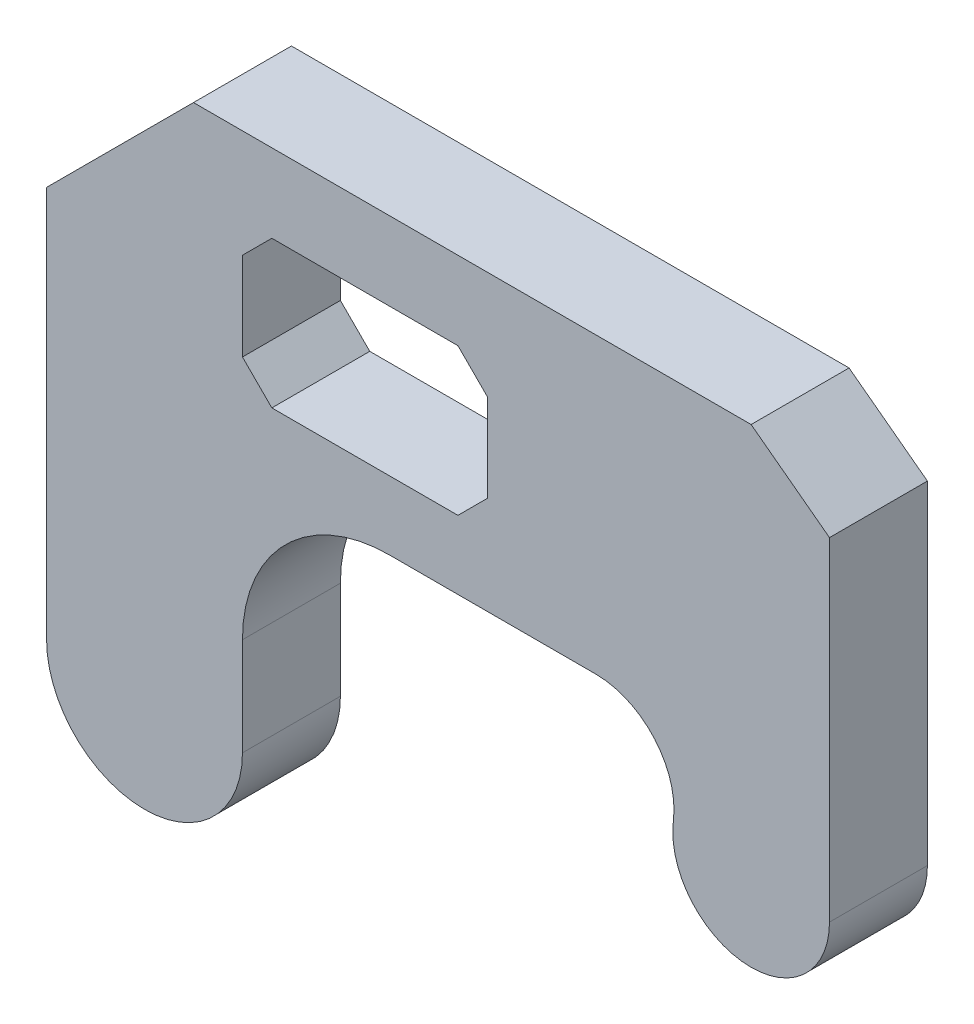
ISO-10303-21;
HEADER;
FILE_DESCRIPTION(('STEP AP214'),'2;1');
FILE_NAME('part.step','',(''),(''),'','','');
FILE_SCHEMA(('AUTOMOTIVE_DESIGN { 1 0 10303 214 1 1 1 1 }'));
ENDSEC;
DATA;
#1=APPLICATION_CONTEXT('core data for automotive mechanical design processes');
#2=APPLICATION_PROTOCOL_DEFINITION('international standard','automotive_design',2000,#1);
#3=PRODUCT_CONTEXT('',#1,'mechanical');
#4=PRODUCT('Part','Part','',(#3));
#5=PRODUCT_RELATED_PRODUCT_CATEGORY('part','',(#4));
#6=PRODUCT_DEFINITION_FORMATION('','',#4);
#7=PRODUCT_DEFINITION_CONTEXT('part definition',#1,'design');
#8=PRODUCT_DEFINITION('design','',#6,#7);
#9=PRODUCT_DEFINITION_SHAPE('','',#8);
#10=(LENGTH_UNIT() NAMED_UNIT(*) SI_UNIT(.MILLI.,.METRE.));
#11=(NAMED_UNIT(*) PLANE_ANGLE_UNIT() SI_UNIT($,.RADIAN.));
#12=(NAMED_UNIT(*) SI_UNIT($,.STERADIAN.) SOLID_ANGLE_UNIT());
#13=UNCERTAINTY_MEASURE_WITH_UNIT(LENGTH_MEASURE(1.E-05),#10,'distance_accuracy_value','');
#14=(GEOMETRIC_REPRESENTATION_CONTEXT(3) GLOBAL_UNCERTAINTY_ASSIGNED_CONTEXT((#13)) GLOBAL_UNIT_ASSIGNED_CONTEXT((#10,
#11,#12)) REPRESENTATION_CONTEXT('',''));
#15=CARTESIAN_POINT('',(0.,0.,0.));
#16=DIRECTION('',(0.,0.,1.));
#17=DIRECTION('',(1.,0.,0.));
#18=AXIS2_PLACEMENT_3D('',#15,#16,#17);
#19=CARTESIAN_POINT('',(10.,0.,10.));
#20=DIRECTION('',(0.,0.,-1.));
#21=DIRECTION('',(-1.,0.,0.));
#22=AXIS2_PLACEMENT_3D('',#19,#20,#21);
#23=PLANE('',#22);
#24=CARTESIAN_POINT('',(10.,0.,10.));
#25=DIRECTION('',(0.,0.,1.));
#26=DIRECTION('',(-1.,0.,0.));
#27=AXIS2_PLACEMENT_3D('',#24,#25,#26);
#28=CIRCLE('',#27,10.);
#29=CARTESIAN_POINT('',(0.,0.,10.));
#30=VERTEX_POINT('',#29);
#31=CARTESIAN_POINT('',(20.,0.,10.));
#32=VERTEX_POINT('',#31);
#33=EDGE_CURVE('E232',#30,#32,#28,.T.);
#34=ORIENTED_EDGE('',*,*,#33,.T.);
#35=DIRECTION('',(0.,1.,0.));
#36=VECTOR('',#35,1.);
#37=CARTESIAN_POINT('',(20.,10.,10.));
#38=LINE('',#37,#36);
#39=CARTESIAN_POINT('',(20.,10.,10.));
#40=VERTEX_POINT('',#39);
#41=EDGE_CURVE('E235',#32,#40,#38,.T.);
#42=ORIENTED_EDGE('',*,*,#41,.T.);
#43=CARTESIAN_POINT('',(35.,10.,10.));
#44=DIRECTION('',(0.,0.,-1.));
#45=DIRECTION('',(1.,0.,0.));
#46=AXIS2_PLACEMENT_3D('',#43,#44,#45);
#47=CIRCLE('',#46,15.);
#48=CARTESIAN_POINT('',(35.,25.,10.));
#49=VERTEX_POINT('',#48);
#50=EDGE_CURVE('E238',#40,#49,#47,.T.);
#51=ORIENTED_EDGE('',*,*,#50,.T.);
#52=DIRECTION('',(1.,0.,0.));
#53=VECTOR('',#52,1.);
#54=CARTESIAN_POINT('',(56.0627460668062,25.,10.));
#55=LINE('',#54,#53);
#56=CARTESIAN_POINT('',(56.0627460668062,25.,10.));
#57=VERTEX_POINT('',#56);
#58=EDGE_CURVE('E240',#49,#57,#55,.T.);
#59=ORIENTED_EDGE('',*,*,#58,.T.);
#60=CARTESIAN_POINT('',(56.0627460668062,17.,10.));
#61=DIRECTION('',(0.,0.,-1.));
#62=DIRECTION('',(1.,0.,0.));
#63=AXIS2_PLACEMENT_3D('',#60,#61,#62);
#64=CIRCLE('',#63,8.);
#65=CARTESIAN_POINT('',(64.,16.,10.));
#66=VERTEX_POINT('',#65);
#67=EDGE_CURVE('E242',#57,#66,#64,.T.);
#68=ORIENTED_EDGE('',*,*,#67,.T.);
#69=CARTESIAN_POINT('',(71.9372539331938,15.,10.));
#70=DIRECTION('',(0.,0.,1.));
#71=DIRECTION('',(-1.,0.,0.));
#72=AXIS2_PLACEMENT_3D('',#69,#70,#71);
#73=CIRCLE('',#72,7.99999999999999);
#74=CARTESIAN_POINT('',(79.9372539331938,15.,10.));
#75=VERTEX_POINT('',#74);
#76=EDGE_CURVE('E244',#66,#75,#73,.T.);
#77=ORIENTED_EDGE('',*,*,#76,.T.);
#78=DIRECTION('',(0.,1.,0.));
#79=VECTOR('',#78,1.);
#80=CARTESIAN_POINT('',(79.9372539331938,49.,10.));
#81=LINE('',#80,#79);
#82=CARTESIAN_POINT('',(79.9372539331938,49.,10.));
#83=VERTEX_POINT('',#82);
#84=EDGE_CURVE('E246',#75,#83,#81,.T.);
#85=ORIENTED_EDGE('',*,*,#84,.T.);
#86=DIRECTION('',(-0.8,0.6,0.));
#87=VECTOR('',#86,1.);
#88=CARTESIAN_POINT('',(71.9372539331938,55.,10.));
#89=LINE('',#88,#87);
#90=CARTESIAN_POINT('',(71.9372539331938,55.,10.));
#91=VERTEX_POINT('',#90);
#92=EDGE_CURVE('E248',#83,#91,#89,.T.);
#93=ORIENTED_EDGE('',*,*,#92,.T.);
#94=DIRECTION('',(-1.,0.,0.));
#95=VECTOR('',#94,1.);
#96=CARTESIAN_POINT('',(15.,55.,10.));
#97=LINE('',#96,#95);
#98=CARTESIAN_POINT('',(15.,55.,10.));
#99=VERTEX_POINT('',#98);
#100=EDGE_CURVE('E250',#91,#99,#97,.T.);
#101=ORIENTED_EDGE('',*,*,#100,.T.);
#102=DIRECTION('',(-0.707106781186547,-0.707106781186548,0.));
#103=VECTOR('',#102,1.);
#104=CARTESIAN_POINT('',(0.,40.,10.));
#105=LINE('',#104,#103);
#106=CARTESIAN_POINT('',(0.,40.,10.));
#107=VERTEX_POINT('',#106);
#108=EDGE_CURVE('E252',#99,#107,#105,.T.);
#109=ORIENTED_EDGE('',*,*,#108,.T.);
#110=DIRECTION('',(0.,-1.,0.));
#111=VECTOR('',#110,1.);
#112=CARTESIAN_POINT('',(0.,0.,10.));
#113=LINE('',#112,#111);
#114=EDGE_CURVE('E254',#107,#30,#113,.T.);
#115=ORIENTED_EDGE('',*,*,#114,.T.);
#116=EDGE_LOOP('',(#34,#42,#51,#59,#68,#77,#85,#93,#101,#109,#115));
#117=FACE_BOUND('',#116,.T.);
#118=DIRECTION('',(-1.,0.,0.));
#119=VECTOR('',#118,1.);
#120=CARTESIAN_POINT('',(23.,47.,10.));
#121=LINE('',#120,#119);
#122=CARTESIAN_POINT('',(42.,47.,10.));
#123=VERTEX_POINT('',#122);
#124=CARTESIAN_POINT('',(23.,47.,10.));
#125=VERTEX_POINT('',#124);
#126=EDGE_CURVE('E167',#123,#125,#121,.T.);
#127=ORIENTED_EDGE('',*,*,#126,.F.);
#128=DIRECTION('',(-0.707106781186547,0.707106781186547,0.));
#129=VECTOR('',#128,1.);
#130=CARTESIAN_POINT('',(42.,47.,10.));
#131=LINE('',#130,#129);
#132=CARTESIAN_POINT('',(45.,44.,10.));
#133=VERTEX_POINT('',#132);
#134=EDGE_CURVE('E200',#133,#123,#131,.T.);
#135=ORIENTED_EDGE('',*,*,#134,.F.);
#136=DIRECTION('',(0.,1.,0.));
#137=VECTOR('',#136,1.);
#138=CARTESIAN_POINT('',(45.,44.,10.));
#139=LINE('',#138,#137);
#140=CARTESIAN_POINT('',(45.,35.,10.));
#141=VERTEX_POINT('',#140);
#142=EDGE_CURVE('E198',#141,#133,#139,.T.);
#143=ORIENTED_EDGE('',*,*,#142,.F.);
#144=DIRECTION('',(0.707106781186547,0.707106781186547,0.));
#145=VECTOR('',#144,1.);
#146=CARTESIAN_POINT('',(42.,32.,10.));
#147=LINE('',#146,#145);
#148=CARTESIAN_POINT('',(42.,32.,10.));
#149=VERTEX_POINT('',#148);
#150=EDGE_CURVE('E196',#149,#141,#147,.T.);
#151=ORIENTED_EDGE('',*,*,#150,.F.);
#152=DIRECTION('',(1.,0.,0.));
#153=VECTOR('',#152,1.);
#154=CARTESIAN_POINT('',(23.,32.,10.));
#155=LINE('',#154,#153);
#156=CARTESIAN_POINT('',(23.,32.,10.));
#157=VERTEX_POINT('',#156);
#158=EDGE_CURVE('E194',#157,#149,#155,.T.);
#159=ORIENTED_EDGE('',*,*,#158,.F.);
#160=DIRECTION('',(0.707106781186547,-0.707106781186548,0.));
#161=VECTOR('',#160,1.);
#162=CARTESIAN_POINT('',(20.,35.,10.));
#163=LINE('',#162,#161);
#164=CARTESIAN_POINT('',(20.,35.,10.));
#165=VERTEX_POINT('',#164);
#166=EDGE_CURVE('E190',#165,#157,#163,.T.);
#167=ORIENTED_EDGE('',*,*,#166,.F.);
#168=DIRECTION('',(0.,-1.,0.));
#169=VECTOR('',#168,1.);
#170=CARTESIAN_POINT('',(20.,44.,10.));
#171=LINE('',#170,#169);
#172=CARTESIAN_POINT('',(20.,44.,10.));
#173=VERTEX_POINT('',#172);
#174=EDGE_CURVE('E188',#173,#165,#171,.T.);
#175=ORIENTED_EDGE('',*,*,#174,.F.);
#176=DIRECTION('',(-0.707106781186547,-0.707106781186548,0.));
#177=VECTOR('',#176,1.);
#178=CARTESIAN_POINT('',(20.,44.,10.));
#179=LINE('',#178,#177);
#180=EDGE_CURVE('E175',#125,#173,#179,.T.);
#181=ORIENTED_EDGE('',*,*,#180,.F.);
#182=EDGE_LOOP('',(#127,#135,#143,#151,#159,#167,#175,#181));
#183=FACE_BOUND('',#182,.T.);
#184=ADVANCED_FACE('F36',(#117,#183),#23,.F.);
#185=CARTESIAN_POINT('',(10.,0.,0.));
#186=DIRECTION('',(0.,0.,-1.));
#187=DIRECTION('',(-1.,0.,0.));
#188=AXIS2_PLACEMENT_3D('',#185,#186,#187);
#189=PLANE('',#188);
#190=CARTESIAN_POINT('',(10.,0.,0.));
#191=DIRECTION('',(0.,0.,1.));
#192=DIRECTION('',(-1.,0.,0.));
#193=AXIS2_PLACEMENT_3D('',#190,#191,#192);
#194=CIRCLE('',#193,10.);
#195=CARTESIAN_POINT('',(0.,0.,0.));
#196=VERTEX_POINT('',#195);
#197=CARTESIAN_POINT('',(20.,0.,0.));
#198=VERTEX_POINT('',#197);
#199=EDGE_CURVE('E183',#196,#198,#194,.T.);
#200=ORIENTED_EDGE('',*,*,#199,.F.);
#201=DIRECTION('',(0.,-1.,0.));
#202=VECTOR('',#201,1.);
#203=CARTESIAN_POINT('',(0.,0.,0.));
#204=LINE('',#203,#202);
#205=CARTESIAN_POINT('',(0.,40.,0.));
#206=VERTEX_POINT('',#205);
#207=EDGE_CURVE('E236',#206,#196,#204,.T.);
#208=ORIENTED_EDGE('',*,*,#207,.F.);
#209=DIRECTION('',(-0.707106781186547,-0.707106781186548,0.));
#210=VECTOR('',#209,1.);
#211=CARTESIAN_POINT('',(0.,40.,0.));
#212=LINE('',#211,#210);
#213=CARTESIAN_POINT('',(15.,55.,0.));
#214=VERTEX_POINT('',#213);
#215=EDGE_CURVE('E275',#214,#206,#212,.T.);
#216=ORIENTED_EDGE('',*,*,#215,.F.);
#217=DIRECTION('',(-1.,0.,0.));
#218=VECTOR('',#217,1.);
#219=CARTESIAN_POINT('',(15.,55.,0.));
#220=LINE('',#219,#218);
#221=CARTESIAN_POINT('',(71.9372539331938,55.,0.));
#222=VERTEX_POINT('',#221);
#223=EDGE_CURVE('E273',#222,#214,#220,.T.);
#224=ORIENTED_EDGE('',*,*,#223,.F.);
#225=DIRECTION('',(-0.8,0.6,0.));
#226=VECTOR('',#225,1.);
#227=CARTESIAN_POINT('',(71.9372539331938,55.,0.));
#228=LINE('',#227,#226);
#229=CARTESIAN_POINT('',(79.9372539331938,49.,0.));
#230=VERTEX_POINT('',#229);
#231=EDGE_CURVE('E271',#230,#222,#228,.T.);
#232=ORIENTED_EDGE('',*,*,#231,.F.);
#233=DIRECTION('',(0.,1.,0.));
#234=VECTOR('',#233,1.);
#235=CARTESIAN_POINT('',(79.9372539331938,49.,0.));
#236=LINE('',#235,#234);
#237=CARTESIAN_POINT('',(79.9372539331938,15.,0.));
#238=VERTEX_POINT('',#237);
#239=EDGE_CURVE('E269',#238,#230,#236,.T.);
#240=ORIENTED_EDGE('',*,*,#239,.F.);
#241=CARTESIAN_POINT('',(71.9372539331938,15.,0.));
#242=DIRECTION('',(0.,0.,1.));
#243=DIRECTION('',(-1.,0.,0.));
#244=AXIS2_PLACEMENT_3D('',#241,#242,#243);
#245=CIRCLE('',#244,7.99999999999999);
#246=CARTESIAN_POINT('',(64.,16.,0.));
#247=VERTEX_POINT('',#246);
#248=EDGE_CURVE('E267',#247,#238,#245,.T.);
#249=ORIENTED_EDGE('',*,*,#248,.F.);
#250=CARTESIAN_POINT('',(56.0627460668062,17.,0.));
#251=DIRECTION('',(0.,0.,-1.));
#252=DIRECTION('',(1.,0.,0.));
#253=AXIS2_PLACEMENT_3D('',#250,#251,#252);
#254=CIRCLE('',#253,8.);
#255=CARTESIAN_POINT('',(56.0627460668062,25.,0.));
#256=VERTEX_POINT('',#255);
#257=EDGE_CURVE('E265',#256,#247,#254,.T.);
#258=ORIENTED_EDGE('',*,*,#257,.F.);
#259=DIRECTION('',(1.,0.,0.));
#260=VECTOR('',#259,1.);
#261=CARTESIAN_POINT('',(56.0627460668062,25.,0.));
#262=LINE('',#261,#260);
#263=CARTESIAN_POINT('',(35.,25.,0.));
#264=VERTEX_POINT('',#263);
#265=EDGE_CURVE('E263',#264,#256,#262,.T.);
#266=ORIENTED_EDGE('',*,*,#265,.F.);
#267=CARTESIAN_POINT('',(35.,10.,0.));
#268=DIRECTION('',(0.,0.,-1.));
#269=DIRECTION('',(1.,0.,0.));
#270=AXIS2_PLACEMENT_3D('',#267,#268,#269);
#271=CIRCLE('',#270,15.);
#272=CARTESIAN_POINT('',(20.,10.,0.));
#273=VERTEX_POINT('',#272);
#274=EDGE_CURVE('E261',#273,#264,#271,.T.);
#275=ORIENTED_EDGE('',*,*,#274,.F.);
#276=DIRECTION('',(0.,1.,0.));
#277=VECTOR('',#276,1.);
#278=CARTESIAN_POINT('',(20.,10.,0.));
#279=LINE('',#278,#277);
#280=EDGE_CURVE('E259',#198,#273,#279,.T.);
#281=ORIENTED_EDGE('',*,*,#280,.F.);
#282=EDGE_LOOP('',(#200,#208,#216,#224,#232,#240,#249,#258,#266,#275,#281));
#283=FACE_BOUND('',#282,.T.);
#284=DIRECTION('',(-0.707106781186547,0.707106781186547,0.));
#285=VECTOR('',#284,1.);
#286=CARTESIAN_POINT('',(42.,47.,0.));
#287=LINE('',#286,#285);
#288=CARTESIAN_POINT('',(45.,44.,0.));
#289=VERTEX_POINT('',#288);
#290=CARTESIAN_POINT('',(42.,47.,0.));
#291=VERTEX_POINT('',#290);
#292=EDGE_CURVE('E176',#289,#291,#287,.T.);
#293=ORIENTED_EDGE('',*,*,#292,.T.);
#294=DIRECTION('',(-1.,0.,0.));
#295=VECTOR('',#294,1.);
#296=CARTESIAN_POINT('',(23.,47.,0.));
#297=LINE('',#296,#295);
#298=CARTESIAN_POINT('',(23.,47.,0.));
#299=VERTEX_POINT('',#298);
#300=EDGE_CURVE('E59',#291,#299,#297,.T.);
#301=ORIENTED_EDGE('',*,*,#300,.T.);
#302=DIRECTION('',(-0.707106781186547,-0.707106781186548,0.));
#303=VECTOR('',#302,1.);
#304=CARTESIAN_POINT('',(20.,44.,0.));
#305=LINE('',#304,#303);
#306=CARTESIAN_POINT('',(20.,44.,0.));
#307=VERTEX_POINT('',#306);
#308=EDGE_CURVE('E182',#299,#307,#305,.T.);
#309=ORIENTED_EDGE('',*,*,#308,.T.);
#310=DIRECTION('',(0.,-1.,0.));
#311=VECTOR('',#310,1.);
#312=CARTESIAN_POINT('',(20.,44.,0.));
#313=LINE('',#312,#311);
#314=CARTESIAN_POINT('',(20.,35.,0.));
#315=VERTEX_POINT('',#314);
#316=EDGE_CURVE('E204',#307,#315,#313,.T.);
#317=ORIENTED_EDGE('',*,*,#316,.T.);
#318=DIRECTION('',(0.707106781186547,-0.707106781186548,0.));
#319=VECTOR('',#318,1.);
#320=CARTESIAN_POINT('',(20.,35.,0.));
#321=LINE('',#320,#319);
#322=CARTESIAN_POINT('',(23.,32.,0.));
#323=VERTEX_POINT('',#322);
#324=EDGE_CURVE('E207',#315,#323,#321,.T.);
#325=ORIENTED_EDGE('',*,*,#324,.T.);
#326=DIRECTION('',(1.,0.,0.));
#327=VECTOR('',#326,1.);
#328=CARTESIAN_POINT('',(23.,32.,0.));
#329=LINE('',#328,#327);
#330=CARTESIAN_POINT('',(42.,32.,0.));
#331=VERTEX_POINT('',#330);
#332=EDGE_CURVE('E210',#323,#331,#329,.T.);
#333=ORIENTED_EDGE('',*,*,#332,.T.);
#334=DIRECTION('',(0.707106781186547,0.707106781186547,0.));
#335=VECTOR('',#334,1.);
#336=CARTESIAN_POINT('',(42.,32.,0.));
#337=LINE('',#336,#335);
#338=CARTESIAN_POINT('',(45.,35.,0.));
#339=VERTEX_POINT('',#338);
#340=EDGE_CURVE('E213',#331,#339,#337,.T.);
#341=ORIENTED_EDGE('',*,*,#340,.T.);
#342=DIRECTION('',(0.,1.,0.));
#343=VECTOR('',#342,1.);
#344=CARTESIAN_POINT('',(45.,44.,0.));
#345=LINE('',#344,#343);
#346=EDGE_CURVE('E216',#339,#289,#345,.T.);
#347=ORIENTED_EDGE('',*,*,#346,.T.);
#348=EDGE_LOOP('',(#293,#301,#309,#317,#325,#333,#341,#347));
#349=FACE_BOUND('',#348,.T.);
#350=ADVANCED_FACE('F314',(#283,#349),#189,.T.);
#351=CARTESIAN_POINT('',(10.,0.,10.));
#352=DIRECTION('',(0.,0.,-1.));
#353=DIRECTION('',(-1.,0.,0.));
#354=AXIS2_PLACEMENT_3D('',#351,#352,#353);
#355=CYLINDRICAL_SURFACE('',#354,10.);
#356=ORIENTED_EDGE('',*,*,#199,.T.);
#357=DIRECTION('',(0.,0.,-1.));
#358=VECTOR('',#357,1.);
#359=CARTESIAN_POINT('',(20.,0.,10.));
#360=LINE('',#359,#358);
#361=EDGE_CURVE('E11',#32,#198,#360,.T.);
#362=ORIENTED_EDGE('',*,*,#361,.F.);
#363=ORIENTED_EDGE('',*,*,#33,.F.);
#364=DIRECTION('',(0.,0.,-1.));
#365=VECTOR('',#364,1.);
#366=CARTESIAN_POINT('',(0.,0.,10.));
#367=LINE('',#366,#365);
#368=EDGE_CURVE('E256',#30,#196,#367,.T.);
#369=ORIENTED_EDGE('',*,*,#368,.T.);
#370=EDGE_LOOP('',(#356,#362,#363,#369));
#371=FACE_BOUND('',#370,.T.);
#372=ADVANCED_FACE('F38',(#371),#355,.T.);
#373=CARTESIAN_POINT('',(20.,10.,10.));
#374=DIRECTION('',(-1.,0.,0.));
#375=DIRECTION('',(0.,-1.,0.));
#376=AXIS2_PLACEMENT_3D('',#373,#374,#375);
#377=PLANE('',#376);
#378=ORIENTED_EDGE('',*,*,#280,.T.);
#379=DIRECTION('',(0.,0.,-1.));
#380=VECTOR('',#379,1.);
#381=CARTESIAN_POINT('',(20.,10.,10.));
#382=LINE('',#381,#380);
#383=EDGE_CURVE('E44',#40,#273,#382,.T.);
#384=ORIENTED_EDGE('',*,*,#383,.F.);
#385=ORIENTED_EDGE('',*,*,#41,.F.);
#386=ORIENTED_EDGE('',*,*,#361,.T.);
#387=EDGE_LOOP('',(#378,#384,#385,#386));
#388=FACE_BOUND('',#387,.T.);
#389=ADVANCED_FACE('F331',(#388),#377,.F.);
#390=CARTESIAN_POINT('',(35.,10.,10.));
#391=DIRECTION('',(0.,0.,-1.));
#392=DIRECTION('',(-1.,0.,0.));
#393=AXIS2_PLACEMENT_3D('',#390,#391,#392);
#394=CYLINDRICAL_SURFACE('',#393,15.);
#395=ORIENTED_EDGE('',*,*,#274,.T.);
#396=DIRECTION('',(0.,0.,-1.));
#397=VECTOR('',#396,1.);
#398=CARTESIAN_POINT('',(35.,25.,10.));
#399=LINE('',#398,#397);
#400=EDGE_CURVE('E301',#49,#264,#399,.T.);
#401=ORIENTED_EDGE('',*,*,#400,.F.);
#402=ORIENTED_EDGE('',*,*,#50,.F.);
#403=ORIENTED_EDGE('',*,*,#383,.T.);
#404=EDGE_LOOP('',(#395,#401,#402,#403));
#405=FACE_BOUND('',#404,.T.);
#406=ADVANCED_FACE('F308',(#405),#394,.F.);
#407=CARTESIAN_POINT('',(56.0627460668062,25.,10.));
#408=DIRECTION('',(0.,1.,0.));
#409=DIRECTION('',(0.,0.,1.));
#410=AXIS2_PLACEMENT_3D('',#407,#408,#409);
#411=PLANE('',#410);
#412=ORIENTED_EDGE('',*,*,#265,.T.);
#413=DIRECTION('',(0.,0.,-1.));
#414=VECTOR('',#413,1.);
#415=CARTESIAN_POINT('',(56.0627460668062,25.,10.));
#416=LINE('',#415,#414);
#417=EDGE_CURVE('E298',#57,#256,#416,.T.);
#418=ORIENTED_EDGE('',*,*,#417,.F.);
#419=ORIENTED_EDGE('',*,*,#58,.F.);
#420=ORIENTED_EDGE('',*,*,#400,.T.);
#421=EDGE_LOOP('',(#412,#418,#419,#420));
#422=FACE_BOUND('',#421,.T.);
#423=ADVANCED_FACE('F320',(#422),#411,.F.);
#424=CARTESIAN_POINT('',(56.0627460668062,17.,10.));
#425=DIRECTION('',(0.,0.,-1.));
#426=DIRECTION('',(-1.,0.,0.));
#427=AXIS2_PLACEMENT_3D('',#424,#425,#426);
#428=CYLINDRICAL_SURFACE('',#427,8.);
#429=ORIENTED_EDGE('',*,*,#257,.T.);
#430=DIRECTION('',(0.,0.,-1.));
#431=VECTOR('',#430,1.);
#432=CARTESIAN_POINT('',(64.,16.,10.));
#433=LINE('',#432,#431);
#434=EDGE_CURVE('E295',#66,#247,#433,.T.);
#435=ORIENTED_EDGE('',*,*,#434,.F.);
#436=ORIENTED_EDGE('',*,*,#67,.F.);
#437=ORIENTED_EDGE('',*,*,#417,.T.);
#438=EDGE_LOOP('',(#429,#435,#436,#437));
#439=FACE_BOUND('',#438,.T.);
#440=ADVANCED_FACE('F324',(#439),#428,.F.);
#441=CARTESIAN_POINT('',(71.9372539331938,15.,10.));
#442=DIRECTION('',(0.,0.,-1.));
#443=DIRECTION('',(-1.,0.,0.));
#444=AXIS2_PLACEMENT_3D('',#441,#442,#443);
#445=CYLINDRICAL_SURFACE('',#444,7.99999999999999);
#446=ORIENTED_EDGE('',*,*,#248,.T.);
#447=DIRECTION('',(0.,0.,-1.));
#448=VECTOR('',#447,1.);
#449=CARTESIAN_POINT('',(79.9372539331938,15.,10.));
#450=LINE('',#449,#448);
#451=EDGE_CURVE('E292',#75,#238,#450,.T.);
#452=ORIENTED_EDGE('',*,*,#451,.F.);
#453=ORIENTED_EDGE('',*,*,#76,.F.);
#454=ORIENTED_EDGE('',*,*,#434,.T.);
#455=EDGE_LOOP('',(#446,#452,#453,#454));
#456=FACE_BOUND('',#455,.T.);
#457=ADVANCED_FACE('F359',(#456),#445,.T.);
#458=CARTESIAN_POINT('',(79.9372539331938,49.,10.));
#459=DIRECTION('',(-1.,0.,0.));
#460=DIRECTION('',(0.,-1.,0.));
#461=AXIS2_PLACEMENT_3D('',#458,#459,#460);
#462=PLANE('',#461);
#463=ORIENTED_EDGE('',*,*,#239,.T.);
#464=DIRECTION('',(0.,0.,-1.));
#465=VECTOR('',#464,1.);
#466=CARTESIAN_POINT('',(79.9372539331938,49.,10.));
#467=LINE('',#466,#465);
#468=EDGE_CURVE('E289',#83,#230,#467,.T.);
#469=ORIENTED_EDGE('',*,*,#468,.F.);
#470=ORIENTED_EDGE('',*,*,#84,.F.);
#471=ORIENTED_EDGE('',*,*,#451,.T.);
#472=EDGE_LOOP('',(#463,#469,#470,#471));
#473=FACE_BOUND('',#472,.T.);
#474=ADVANCED_FACE('F357',(#473),#462,.F.);
#475=CARTESIAN_POINT('',(71.9372539331938,55.,10.));
#476=DIRECTION('',(-0.6,-0.8,0.));
#477=DIRECTION('',(0.8,-0.6,0.));
#478=AXIS2_PLACEMENT_3D('',#475,#476,#477);
#479=PLANE('',#478);
#480=ORIENTED_EDGE('',*,*,#231,.T.);
#481=DIRECTION('',(0.,0.,-1.));
#482=VECTOR('',#481,1.);
#483=CARTESIAN_POINT('',(71.9372539331938,55.,10.));
#484=LINE('',#483,#482);
#485=EDGE_CURVE('E286',#91,#222,#484,.T.);
#486=ORIENTED_EDGE('',*,*,#485,.F.);
#487=ORIENTED_EDGE('',*,*,#92,.F.);
#488=ORIENTED_EDGE('',*,*,#468,.T.);
#489=EDGE_LOOP('',(#480,#486,#487,#488));
#490=FACE_BOUND('',#489,.T.);
#491=ADVANCED_FACE('F352',(#490),#479,.F.);
#492=CARTESIAN_POINT('',(15.,55.,10.));
#493=DIRECTION('',(0.,-1.,0.));
#494=DIRECTION('',(0.,0.,-1.));
#495=AXIS2_PLACEMENT_3D('',#492,#493,#494);
#496=PLANE('',#495);
#497=ORIENTED_EDGE('',*,*,#223,.T.);
#498=DIRECTION('',(0.,0.,-1.));
#499=VECTOR('',#498,1.);
#500=CARTESIAN_POINT('',(15.,55.,10.));
#501=LINE('',#500,#499);
#502=EDGE_CURVE('E283',#99,#214,#501,.T.);
#503=ORIENTED_EDGE('',*,*,#502,.F.);
#504=ORIENTED_EDGE('',*,*,#100,.F.);
#505=ORIENTED_EDGE('',*,*,#485,.T.);
#506=EDGE_LOOP('',(#497,#503,#504,#505));
#507=FACE_BOUND('',#506,.T.);
#508=ADVANCED_FACE('F347',(#507),#496,.F.);
#509=CARTESIAN_POINT('',(0.,40.,10.));
#510=DIRECTION('',(0.707106781186548,-0.707106781186547,0.));
#511=DIRECTION('',(0.707106781186547,0.707106781186548,0.));
#512=AXIS2_PLACEMENT_3D('',#509,#510,#511);
#513=PLANE('',#512);
#514=ORIENTED_EDGE('',*,*,#215,.T.);
#515=DIRECTION('',(0.,0.,-1.));
#516=VECTOR('',#515,1.);
#517=CARTESIAN_POINT('',(0.,40.,10.));
#518=LINE('',#517,#516);
#519=EDGE_CURVE('E280',#107,#206,#518,.T.);
#520=ORIENTED_EDGE('',*,*,#519,.F.);
#521=ORIENTED_EDGE('',*,*,#108,.F.);
#522=ORIENTED_EDGE('',*,*,#502,.T.);
#523=EDGE_LOOP('',(#514,#520,#521,#522));
#524=FACE_BOUND('',#523,.T.);
#525=ADVANCED_FACE('F343',(#524),#513,.F.);
#526=CARTESIAN_POINT('',(0.,0.,10.));
#527=DIRECTION('',(1.,0.,0.));
#528=DIRECTION('',(0.,0.,-1.));
#529=AXIS2_PLACEMENT_3D('',#526,#527,#528);
#530=PLANE('',#529);
#531=ORIENTED_EDGE('',*,*,#207,.T.);
#532=ORIENTED_EDGE('',*,*,#368,.F.);
#533=ORIENTED_EDGE('',*,*,#114,.F.);
#534=ORIENTED_EDGE('',*,*,#519,.T.);
#535=EDGE_LOOP('',(#531,#532,#533,#534));
#536=FACE_BOUND('',#535,.T.);
#537=ADVANCED_FACE('F338',(#536),#530,.F.);
#538=CARTESIAN_POINT('',(23.,47.,10.));
#539=DIRECTION('',(0.,-1.,0.));
#540=DIRECTION('',(0.,0.,-1.));
#541=AXIS2_PLACEMENT_3D('',#538,#539,#540);
#542=PLANE('',#541);
#543=ORIENTED_EDGE('',*,*,#300,.F.);
#544=DIRECTION('',(0.,0.,-1.));
#545=VECTOR('',#544,1.);
#546=CARTESIAN_POINT('',(42.,47.,10.));
#547=LINE('',#546,#545);
#548=EDGE_CURVE('E171',#123,#291,#547,.T.);
#549=ORIENTED_EDGE('',*,*,#548,.F.);
#550=ORIENTED_EDGE('',*,*,#126,.T.);
#551=DIRECTION('',(0.,0.,-1.));
#552=VECTOR('',#551,1.);
#553=CARTESIAN_POINT('',(23.,47.,10.));
#554=LINE('',#553,#552);
#555=EDGE_CURVE('E170',#125,#299,#554,.T.);
#556=ORIENTED_EDGE('',*,*,#555,.T.);
#557=EDGE_LOOP('',(#543,#549,#550,#556));
#558=FACE_BOUND('',#557,.T.);
#559=ADVANCED_FACE('F169',(#558),#542,.T.);
#560=CARTESIAN_POINT('',(20.,44.,10.));
#561=DIRECTION('',(0.707106781186548,-0.707106781186547,0.));
#562=DIRECTION('',(0.707106781186547,0.707106781186548,0.));
#563=AXIS2_PLACEMENT_3D('',#560,#561,#562);
#564=PLANE('',#563);
#565=ORIENTED_EDGE('',*,*,#308,.F.);
#566=ORIENTED_EDGE('',*,*,#555,.F.);
#567=ORIENTED_EDGE('',*,*,#180,.T.);
#568=DIRECTION('',(0.,0.,-1.));
#569=VECTOR('',#568,1.);
#570=CARTESIAN_POINT('',(20.,44.,10.));
#571=LINE('',#570,#569);
#572=EDGE_CURVE('E184',#173,#307,#571,.T.);
#573=ORIENTED_EDGE('',*,*,#572,.T.);
#574=EDGE_LOOP('',(#565,#566,#567,#573));
#575=FACE_BOUND('',#574,.T.);
#576=ADVANCED_FACE('F179',(#575),#564,.T.);
#577=CARTESIAN_POINT('',(20.,44.,10.));
#578=DIRECTION('',(1.,0.,0.));
#579=DIRECTION('',(0.,1.,0.));
#580=AXIS2_PLACEMENT_3D('',#577,#578,#579);
#581=PLANE('',#580);
#582=ORIENTED_EDGE('',*,*,#316,.F.);
#583=ORIENTED_EDGE('',*,*,#572,.F.);
#584=ORIENTED_EDGE('',*,*,#174,.T.);
#585=DIRECTION('',(0.,0.,-1.));
#586=VECTOR('',#585,1.);
#587=CARTESIAN_POINT('',(20.,35.,10.));
#588=LINE('',#587,#586);
#589=EDGE_CURVE('E229',#165,#315,#588,.T.);
#590=ORIENTED_EDGE('',*,*,#589,.T.);
#591=EDGE_LOOP('',(#582,#583,#584,#590));
#592=FACE_BOUND('',#591,.T.);
#593=ADVANCED_FACE('F411',(#592),#581,.T.);
#594=CARTESIAN_POINT('',(20.,35.,10.));
#595=DIRECTION('',(0.707106781186548,0.707106781186547,0.));
#596=DIRECTION('',(-0.707106781186547,0.707106781186548,0.));
#597=AXIS2_PLACEMENT_3D('',#594,#595,#596);
#598=PLANE('',#597);
#599=ORIENTED_EDGE('',*,*,#324,.F.);
#600=ORIENTED_EDGE('',*,*,#589,.F.);
#601=ORIENTED_EDGE('',*,*,#166,.T.);
#602=DIRECTION('',(0.,0.,-1.));
#603=VECTOR('',#602,1.);
#604=CARTESIAN_POINT('',(23.,32.,10.));
#605=LINE('',#604,#603);
#606=EDGE_CURVE('E227',#157,#323,#605,.T.);
#607=ORIENTED_EDGE('',*,*,#606,.T.);
#608=EDGE_LOOP('',(#599,#600,#601,#607));
#609=FACE_BOUND('',#608,.T.);
#610=ADVANCED_FACE('F417',(#609),#598,.T.);
#611=CARTESIAN_POINT('',(23.,32.,10.));
#612=DIRECTION('',(0.,1.,0.));
#613=DIRECTION('',(0.,0.,1.));
#614=AXIS2_PLACEMENT_3D('',#611,#612,#613);
#615=PLANE('',#614);
#616=ORIENTED_EDGE('',*,*,#332,.F.);
#617=ORIENTED_EDGE('',*,*,#606,.F.);
#618=ORIENTED_EDGE('',*,*,#158,.T.);
#619=DIRECTION('',(0.,0.,-1.));
#620=VECTOR('',#619,1.);
#621=CARTESIAN_POINT('',(42.,32.,10.));
#622=LINE('',#621,#620);
#623=EDGE_CURVE('E225',#149,#331,#622,.T.);
#624=ORIENTED_EDGE('',*,*,#623,.T.);
#625=EDGE_LOOP('',(#616,#617,#618,#624));
#626=FACE_BOUND('',#625,.T.);
#627=ADVANCED_FACE('F425',(#626),#615,.T.);
#628=CARTESIAN_POINT('',(42.,32.,10.));
#629=DIRECTION('',(-0.707106781186548,0.707106781186548,0.));
#630=DIRECTION('',(-0.707106781186548,-0.707106781186548,0.));
#631=AXIS2_PLACEMENT_3D('',#628,#629,#630);
#632=PLANE('',#631);
#633=ORIENTED_EDGE('',*,*,#340,.F.);
#634=ORIENTED_EDGE('',*,*,#623,.F.);
#635=ORIENTED_EDGE('',*,*,#150,.T.);
#636=DIRECTION('',(0.,0.,-1.));
#637=VECTOR('',#636,1.);
#638=CARTESIAN_POINT('',(45.,35.,10.));
#639=LINE('',#638,#637);
#640=EDGE_CURVE('E223',#141,#339,#639,.T.);
#641=ORIENTED_EDGE('',*,*,#640,.T.);
#642=EDGE_LOOP('',(#633,#634,#635,#641));
#643=FACE_BOUND('',#642,.T.);
#644=ADVANCED_FACE('F433',(#643),#632,.T.);
#645=CARTESIAN_POINT('',(45.,44.,10.));
#646=DIRECTION('',(-1.,0.,0.));
#647=DIRECTION('',(0.,0.,1.));
#648=AXIS2_PLACEMENT_3D('',#645,#646,#647);
#649=PLANE('',#648);
#650=ORIENTED_EDGE('',*,*,#346,.F.);
#651=ORIENTED_EDGE('',*,*,#640,.F.);
#652=ORIENTED_EDGE('',*,*,#142,.T.);
#653=DIRECTION('',(0.,0.,-1.));
#654=VECTOR('',#653,1.);
#655=CARTESIAN_POINT('',(45.,44.,10.));
#656=LINE('',#655,#654);
#657=EDGE_CURVE('E51',#133,#289,#656,.T.);
#658=ORIENTED_EDGE('',*,*,#657,.T.);
#659=EDGE_LOOP('',(#650,#651,#652,#658));
#660=FACE_BOUND('',#659,.T.);
#661=ADVANCED_FACE('F441',(#660),#649,.T.);
#662=CARTESIAN_POINT('',(42.,47.,10.));
#663=DIRECTION('',(-0.707106781186548,-0.707106781186548,0.));
#664=DIRECTION('',(0.707106781186548,-0.707106781186548,0.));
#665=AXIS2_PLACEMENT_3D('',#662,#663,#664);
#666=PLANE('',#665);
#667=ORIENTED_EDGE('',*,*,#292,.F.);
#668=ORIENTED_EDGE('',*,*,#657,.F.);
#669=ORIENTED_EDGE('',*,*,#134,.T.);
#670=ORIENTED_EDGE('',*,*,#548,.T.);
#671=EDGE_LOOP('',(#667,#668,#669,#670));
#672=FACE_BOUND('',#671,.T.);
#673=ADVANCED_FACE('F449',(#672),#666,.T.);
#674=CLOSED_SHELL('',(#184,#350,#372,#389,#406,#423,#440,#457,#474,#491,#508,#525,#537,#559,
#576,#593,#610,#627,#644,#661,#673));
#675=MANIFOLD_SOLID_BREP('B2',#674);
#676=ADVANCED_BREP_SHAPE_REPRESENTATION('',(#18,#675),#14);
#677=SHAPE_DEFINITION_REPRESENTATION(#9,#676);
ENDSEC;
END-ISO-10303-21;
